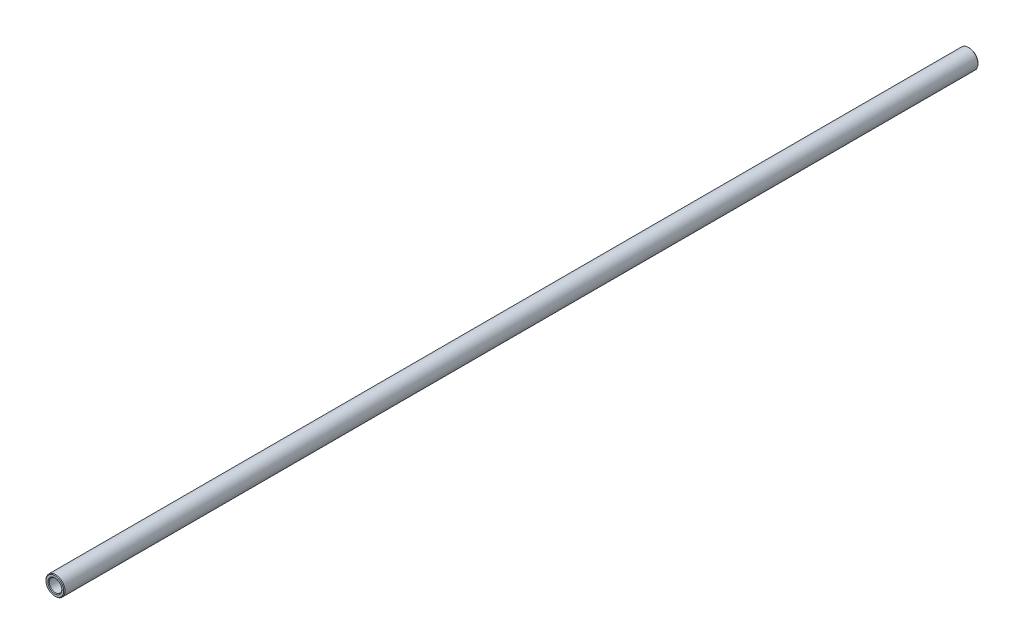
ISO-10303-21;
HEADER;
FILE_DESCRIPTION(('STEP AP214'),'2;1');
FILE_NAME('part.step','',(''),(''),'','','');
FILE_SCHEMA(('AUTOMOTIVE_DESIGN { 1 0 10303 214 1 1 1 1 }'));
ENDSEC;
DATA;
#1=APPLICATION_CONTEXT('core data for automotive mechanical design processes');
#2=APPLICATION_PROTOCOL_DEFINITION('international standard','automotive_design',2000,#1);
#3=PRODUCT_CONTEXT('',#1,'mechanical');
#4=PRODUCT('Part','Part','',(#3));
#5=PRODUCT_RELATED_PRODUCT_CATEGORY('part','',(#4));
#6=PRODUCT_DEFINITION_FORMATION('','',#4);
#7=PRODUCT_DEFINITION_CONTEXT('part definition',#1,'design');
#8=PRODUCT_DEFINITION('design','',#6,#7);
#9=PRODUCT_DEFINITION_SHAPE('','',#8);
#10=(LENGTH_UNIT() NAMED_UNIT(*) SI_UNIT(.MILLI.,.METRE.));
#11=(NAMED_UNIT(*) PLANE_ANGLE_UNIT() SI_UNIT($,.RADIAN.));
#12=(NAMED_UNIT(*) SI_UNIT($,.STERADIAN.) SOLID_ANGLE_UNIT());
#13=UNCERTAINTY_MEASURE_WITH_UNIT(LENGTH_MEASURE(1.E-05),#10,'distance_accuracy_value','');
#14=(GEOMETRIC_REPRESENTATION_CONTEXT(3) GLOBAL_UNCERTAINTY_ASSIGNED_CONTEXT((#13)) GLOBAL_UNIT_ASSIGNED_CONTEXT((#10,
#11,#12)) REPRESENTATION_CONTEXT('',''));
#15=CARTESIAN_POINT('',(0.,0.,0.));
#16=DIRECTION('',(0.,0.,1.));
#17=DIRECTION('',(1.,0.,0.));
#18=AXIS2_PLACEMENT_3D('',#15,#16,#17);
#19=CARTESIAN_POINT('',(0.,0.,-152.4));
#20=DIRECTION('',(0.,0.,1.));
#21=DIRECTION('',(1.,0.,0.));
#22=AXIS2_PLACEMENT_3D('',#19,#20,#21);
#23=CYLINDRICAL_SURFACE('',#22,3.175);
#24=CARTESIAN_POINT('',(0.,0.,152.18664));
#25=DIRECTION('',(0.,0.,1.));
#26=DIRECTION('',(1.,0.,0.));
#27=AXIS2_PLACEMENT_3D('',#24,#25,#26);
#28=CIRCLE('',#27,3.175);
#29=CARTESIAN_POINT('',(3.175,0.,152.18664));
#30=VERTEX_POINT('',#29);
#31=EDGE_CURVE('E50',#30,#30,#28,.F.);
#32=CARTESIAN_POINT('',(0.,0.,-152.18664));
#33=DIRECTION('',(0.,0.,1.));
#34=DIRECTION('',(1.,0.,0.));
#35=AXIS2_PLACEMENT_3D('',#32,#33,#34);
#36=CIRCLE('',#35,3.175);
#37=CARTESIAN_POINT('',(3.175,0.,-152.18664));
#38=VERTEX_POINT('',#37);
#39=EDGE_CURVE('E53',#38,#38,#36,.T.);
#40=CARTESIAN_POINT('',(3.175,0.,152.18664));
#41=CARTESIAN_POINT('',(3.175,0.,149.016085));
#42=CARTESIAN_POINT('',(3.175,0.,145.84553));
#43=CARTESIAN_POINT('',(3.175,0.,139.50442));
#44=CARTESIAN_POINT('',(3.175,0.,136.333865));
#45=CARTESIAN_POINT('',(3.175,0.,129.992755));
#46=CARTESIAN_POINT('',(3.175,0.,126.8222));
#47=CARTESIAN_POINT('',(3.175,0.,120.48109));
#48=CARTESIAN_POINT('',(3.175,0.,117.310535));
#49=CARTESIAN_POINT('',(3.175,0.,110.969425));
#50=CARTESIAN_POINT('',(3.175,0.,107.79887));
#51=CARTESIAN_POINT('',(3.175,0.,101.45776));
#52=CARTESIAN_POINT('',(3.175,0.,98.2872050000001));
#53=CARTESIAN_POINT('',(3.175,0.,91.9460950000001));
#54=CARTESIAN_POINT('',(3.175,0.,88.7755400000001));
#55=CARTESIAN_POINT('',(3.175,0.,82.4344300000001));
#56=CARTESIAN_POINT('',(3.175,0.,79.2638750000001));
#57=CARTESIAN_POINT('',(3.175,0.,72.9227650000001));
#58=CARTESIAN_POINT('',(3.175,0.,69.7522100000001));
#59=CARTESIAN_POINT('',(3.175,0.,63.4111000000001));
#60=CARTESIAN_POINT('',(3.175,0.,60.2405450000001));
#61=CARTESIAN_POINT('',(3.175,0.,53.8994350000001));
#62=CARTESIAN_POINT('',(3.175,0.,50.7288800000001));
#63=CARTESIAN_POINT('',(3.175,0.,44.3877700000001));
#64=CARTESIAN_POINT('',(3.175,0.,41.2172150000001));
#65=CARTESIAN_POINT('',(3.175,0.,34.8761050000001));
#66=CARTESIAN_POINT('',(3.175,0.,31.7055500000001));
#67=CARTESIAN_POINT('',(3.175,0.,25.3644400000001));
#68=CARTESIAN_POINT('',(3.175,0.,22.1938850000001));
#69=CARTESIAN_POINT('',(3.175,0.,15.8527750000001));
#70=CARTESIAN_POINT('',(3.175,0.,12.6822200000001));
#71=CARTESIAN_POINT('',(3.175,0.,6.34111000000011));
#72=CARTESIAN_POINT('',(3.175,0.,3.17055500000011));
#73=CARTESIAN_POINT('',(3.175,0.,-3.17055499999989));
#74=CARTESIAN_POINT('',(3.175,0.,-6.34110999999989));
#75=CARTESIAN_POINT('',(3.175,0.,-12.6822199999999));
#76=CARTESIAN_POINT('',(3.175,0.,-15.8527749999999));
#77=CARTESIAN_POINT('',(3.175,0.,-22.1938849999999));
#78=CARTESIAN_POINT('',(3.175,0.,-25.3644399999999));
#79=CARTESIAN_POINT('',(3.175,0.,-31.7055499999999));
#80=CARTESIAN_POINT('',(3.175,0.,-34.8761049999999));
#81=CARTESIAN_POINT('',(3.175,0.,-41.2172149999999));
#82=CARTESIAN_POINT('',(3.175,0.,-44.3877699999999));
#83=CARTESIAN_POINT('',(3.175,0.,-50.7288799999999));
#84=CARTESIAN_POINT('',(3.175,0.,-53.8994349999999));
#85=CARTESIAN_POINT('',(3.175,0.,-60.2405449999999));
#86=CARTESIAN_POINT('',(3.175,0.,-63.4110999999999));
#87=CARTESIAN_POINT('',(3.175,0.,-69.7522099999999));
#88=CARTESIAN_POINT('',(3.175,0.,-72.9227649999999));
#89=CARTESIAN_POINT('',(3.175,0.,-79.2638749999999));
#90=CARTESIAN_POINT('',(3.175,0.,-82.4344299999999));
#91=CARTESIAN_POINT('',(3.175,0.,-88.7755399999999));
#92=CARTESIAN_POINT('',(3.175,0.,-91.9460949999999));
#93=CARTESIAN_POINT('',(3.175,0.,-98.2872049999998));
#94=CARTESIAN_POINT('',(3.175,0.,-101.45776));
#95=CARTESIAN_POINT('',(3.175,0.,-107.79887));
#96=CARTESIAN_POINT('',(3.175,0.,-110.969425));
#97=CARTESIAN_POINT('',(3.175,0.,-117.310535));
#98=CARTESIAN_POINT('',(3.175,0.,-120.48109));
#99=CARTESIAN_POINT('',(3.175,0.,-126.8222));
#100=CARTESIAN_POINT('',(3.175,0.,-129.992755));
#101=CARTESIAN_POINT('',(3.175,0.,-136.333865));
#102=CARTESIAN_POINT('',(3.175,0.,-139.50442));
#103=CARTESIAN_POINT('',(3.175,0.,-145.84553));
#104=CARTESIAN_POINT('',(3.175,0.,-149.016085));
#105=CARTESIAN_POINT('',(3.175,0.,-152.18664));
#106=B_SPLINE_CURVE_WITH_KNOTS('',3,(#40,#41,#42,#43,#44,#45,#46,#47,#48,#49,#50,#51,#52,#53,
#54,#55,#56,#57,#58,#59,#60,#61,#62,#63,#64,#65,#66,#67,#68,#69,#70,#71,#72,#73,#74,#75,#76,#77,
#78,#79,#80,#81,#82,#83,#84,#85,#86,#87,#88,#89,#90,#91,#92,#93,#94,#95,#96,#97,#98,#99,#100,
#101,#102,#103,#104,#105),.UNSPECIFIED.,.F.,.F.,(4,2,2,2,2,2,2,2,2,2,2,2,2,2,2,2,2,2,2,2,2,2,2,
2,2,2,2,2,2,2,2,2,4),(0.,9.511665,19.02333,28.534995,38.04666,47.558325,57.06999,66.581655,
76.09332,85.604985,95.11665,104.628315,114.13998,123.651645,133.16331,142.674975,152.18664,
161.698305,171.20997,180.721635,190.2333,199.744965,209.25663,218.768295,228.27996,237.791625,
247.30329,256.814955,266.32662,275.838285,285.34995,294.861615,304.37328),.UNSPECIFIED.);
#107=EDGE_CURVE('BSEAM30',#30,#38,#106,.T.);
#108=ORIENTED_EDGE('',*,*,#31,.T.);
#109=ORIENTED_EDGE('',*,*,#39,.T.);
#110=ORIENTED_EDGE('',*,*,#107,.T.);
#111=ORIENTED_EDGE('',*,*,#107,.F.);
#112=EDGE_LOOP('',(#108,#110,#109,#111));
#113=FACE_BOUND('',#112,.T.);
#114=ADVANCED_FACE('F30',(#113),#23,.T.);
#115=CARTESIAN_POINT('',(0.,0.,-152.4));
#116=DIRECTION('',(0.,0.,1.));
#117=DIRECTION('',(1.,0.,0.));
#118=AXIS2_PLACEMENT_3D('',#115,#116,#117);
#119=PLANE('',#118);
#120=CARTESIAN_POINT('',(0.,0.,-152.4));
#121=DIRECTION('',(0.,0.,1.));
#122=DIRECTION('',(1.,0.,0.));
#123=AXIS2_PLACEMENT_3D('',#120,#121,#122);
#124=CIRCLE('',#123,2.96163999999979);
#125=CARTESIAN_POINT('',(2.96163999999979,0.,-152.4));
#126=VERTEX_POINT('',#125);
#127=EDGE_CURVE('E41',#126,#126,#124,.F.);
#128=ORIENTED_EDGE('',*,*,#127,.T.);
#129=EDGE_LOOP('',(#128));
#130=FACE_BOUND('',#129,.T.);
#131=CARTESIAN_POINT('',(0.,0.,-152.4));
#132=DIRECTION('',(0.,0.,1.));
#133=DIRECTION('',(1.,0.,0.));
#134=AXIS2_PLACEMENT_3D('',#131,#132,#133);
#135=CIRCLE('',#134,2.32155999999975);
#136=CARTESIAN_POINT('',(2.32155999999975,0.,-152.4));
#137=VERTEX_POINT('',#136);
#138=EDGE_CURVE('E45',#137,#137,#135,.T.);
#139=ORIENTED_EDGE('',*,*,#138,.T.);
#140=EDGE_LOOP('',(#139));
#141=FACE_BOUND('',#140,.T.);
#142=ADVANCED_FACE('F78',(#130,#141),#119,.F.);
#143=CARTESIAN_POINT('',(0.,0.,-152.4));
#144=DIRECTION('',(0.,0.,1.));
#145=DIRECTION('',(1.,0.,0.));
#146=AXIS2_PLACEMENT_3D('',#143,#144,#145);
#147=CYLINDRICAL_SURFACE('',#146,2.1082);
#148=CARTESIAN_POINT('',(0.,0.,152.18664));
#149=DIRECTION('',(0.,0.,1.));
#150=DIRECTION('',(1.,0.,0.));
#151=AXIS2_PLACEMENT_3D('',#148,#149,#150);
#152=CIRCLE('',#151,2.1082);
#153=CARTESIAN_POINT('',(2.1082,0.,152.18664));
#154=VERTEX_POINT('',#153);
#155=EDGE_CURVE('E10',#154,#154,#152,.T.);
#156=CARTESIAN_POINT('',(0.,0.,-152.18664));
#157=DIRECTION('',(0.,0.,1.));
#158=DIRECTION('',(1.,0.,0.));
#159=AXIS2_PLACEMENT_3D('',#156,#157,#158);
#160=CIRCLE('',#159,2.1082);
#161=CARTESIAN_POINT('',(2.1082,0.,-152.18664));
#162=VERTEX_POINT('',#161);
#163=EDGE_CURVE('E37',#162,#162,#160,.F.);
#164=CARTESIAN_POINT('',(2.1082,0.,152.18664));
#165=CARTESIAN_POINT('',(2.1082,0.,149.016085));
#166=CARTESIAN_POINT('',(2.1082,0.,145.84553));
#167=CARTESIAN_POINT('',(2.1082,0.,139.50442));
#168=CARTESIAN_POINT('',(2.1082,0.,136.333865));
#169=CARTESIAN_POINT('',(2.1082,0.,129.992755));
#170=CARTESIAN_POINT('',(2.1082,0.,126.8222));
#171=CARTESIAN_POINT('',(2.1082,0.,120.48109));
#172=CARTESIAN_POINT('',(2.1082,0.,117.310535));
#173=CARTESIAN_POINT('',(2.1082,0.,110.969425));
#174=CARTESIAN_POINT('',(2.1082,0.,107.79887));
#175=CARTESIAN_POINT('',(2.1082,0.,101.45776));
#176=CARTESIAN_POINT('',(2.1082,0.,98.2872049999997));
#177=CARTESIAN_POINT('',(2.1082,0.,91.9460949999997));
#178=CARTESIAN_POINT('',(2.1082,0.,88.7755399999998));
#179=CARTESIAN_POINT('',(2.1082,0.,82.4344299999997));
#180=CARTESIAN_POINT('',(2.1082,0.,79.2638749999997));
#181=CARTESIAN_POINT('',(2.1082,0.,72.9227649999997));
#182=CARTESIAN_POINT('',(2.1082,0.,69.7522099999997));
#183=CARTESIAN_POINT('',(2.1082,0.,63.4110999999997));
#184=CARTESIAN_POINT('',(2.1082,0.,60.2405449999997));
#185=CARTESIAN_POINT('',(2.1082,0.,53.8994349999997));
#186=CARTESIAN_POINT('',(2.1082,0.,50.7288799999997));
#187=CARTESIAN_POINT('',(2.1082,0.,44.3877699999997));
#188=CARTESIAN_POINT('',(2.1082,0.,41.2172149999998));
#189=CARTESIAN_POINT('',(2.1082,0.,34.8761049999998));
#190=CARTESIAN_POINT('',(2.1082,0.,31.7055499999998));
#191=CARTESIAN_POINT('',(2.1082,0.,25.3644399999998));
#192=CARTESIAN_POINT('',(2.1082,0.,22.1938849999998));
#193=CARTESIAN_POINT('',(2.1082,0.,15.8527749999998));
#194=CARTESIAN_POINT('',(2.1082,0.,12.6822199999998));
#195=CARTESIAN_POINT('',(2.1082,0.,6.34110999999975));
#196=CARTESIAN_POINT('',(2.1082,0.,3.17055499999975));
#197=CARTESIAN_POINT('',(2.1082,0.,-3.17055500000025));
#198=CARTESIAN_POINT('',(2.1082,0.,-6.34111000000025));
#199=CARTESIAN_POINT('',(2.1082,0.,-12.6822200000003));
#200=CARTESIAN_POINT('',(2.1082,0.,-15.8527750000003));
#201=CARTESIAN_POINT('',(2.1082,0.,-22.1938850000003));
#202=CARTESIAN_POINT('',(2.1082,0.,-25.3644400000002));
#203=CARTESIAN_POINT('',(2.1082,0.,-31.7055500000002));
#204=CARTESIAN_POINT('',(2.1082,0.,-34.8761050000002));
#205=CARTESIAN_POINT('',(2.1082,0.,-41.2172150000002));
#206=CARTESIAN_POINT('',(2.1082,0.,-44.3877700000003));
#207=CARTESIAN_POINT('',(2.1082,0.,-50.7288800000002));
#208=CARTESIAN_POINT('',(2.1082,0.,-53.8994350000003));
#209=CARTESIAN_POINT('',(2.1082,0.,-60.2405450000002));
#210=CARTESIAN_POINT('',(2.1082,0.,-63.4111000000002));
#211=CARTESIAN_POINT('',(2.1082,0.,-69.7522100000002));
#212=CARTESIAN_POINT('',(2.1082,0.,-72.9227650000002));
#213=CARTESIAN_POINT('',(2.1082,0.,-79.2638750000002));
#214=CARTESIAN_POINT('',(2.1082,0.,-82.4344300000002));
#215=CARTESIAN_POINT('',(2.1082,0.,-88.7755400000002));
#216=CARTESIAN_POINT('',(2.1082,0.,-91.9460950000002));
#217=CARTESIAN_POINT('',(2.1082,0.,-98.2872050000002));
#218=CARTESIAN_POINT('',(2.1082,0.,-101.45776));
#219=CARTESIAN_POINT('',(2.1082,0.,-107.79887));
#220=CARTESIAN_POINT('',(2.1082,0.,-110.969425));
#221=CARTESIAN_POINT('',(2.1082,0.,-117.310535));
#222=CARTESIAN_POINT('',(2.1082,0.,-120.48109));
#223=CARTESIAN_POINT('',(2.1082,0.,-126.8222));
#224=CARTESIAN_POINT('',(2.1082,0.,-129.992755));
#225=CARTESIAN_POINT('',(2.1082,0.,-136.333865));
#226=CARTESIAN_POINT('',(2.1082,0.,-139.50442));
#227=CARTESIAN_POINT('',(2.1082,0.,-145.84553));
#228=CARTESIAN_POINT('',(2.1082,0.,-149.016085));
#229=CARTESIAN_POINT('',(2.1082,0.,-152.18664));
#230=B_SPLINE_CURVE_WITH_KNOTS('',3,(#164,#165,#166,#167,#168,#169,#170,#171,#172,#173,#174,
#175,#176,#177,#178,#179,#180,#181,#182,#183,#184,#185,#186,#187,#188,#189,#190,#191,#192,#193,
#194,#195,#196,#197,#198,#199,#200,#201,#202,#203,#204,#205,#206,#207,#208,#209,#210,#211,#212,
#213,#214,#215,#216,#217,#218,#219,#220,#221,#222,#223,#224,#225,#226,#227,#228,#229),
.UNSPECIFIED.,.F.,.F.,(4,2,2,2,2,2,2,2,2,2,2,2,2,2,2,2,2,2,2,2,2,2,2,2,2,2,2,2,2,2,2,2,4),(0.,
9.511665,19.02333,28.534995,38.04666,47.558325,57.06999,66.581655,76.09332,85.604985,95.11665,
104.628315,114.13998,123.651645,133.16331,142.674975,152.18664,161.698305,171.20997,180.721635,
190.2333,199.744965,209.25663,218.768295,228.27996,237.791625,247.30329,256.814955,266.32662,
275.838285,285.34995,294.861615,304.37328),.UNSPECIFIED.);
#231=EDGE_CURVE('BSEAM84',#154,#162,#230,.T.);
#232=ORIENTED_EDGE('',*,*,#155,.T.);
#233=ORIENTED_EDGE('',*,*,#163,.T.);
#234=ORIENTED_EDGE('',*,*,#231,.T.);
#235=ORIENTED_EDGE('',*,*,#231,.F.);
#236=EDGE_LOOP('',(#232,#234,#233,#235));
#237=FACE_BOUND('',#236,.T.);
#238=ADVANCED_FACE('F84',(#237),#147,.F.);
#239=CARTESIAN_POINT('',(0.,0.,152.4));
#240=DIRECTION('',(0.,0.,1.));
#241=DIRECTION('',(1.,0.,0.));
#242=AXIS2_PLACEMENT_3D('',#239,#240,#241);
#243=PLANE('',#242);
#244=CARTESIAN_POINT('',(0.,0.,152.4));
#245=DIRECTION('',(0.,0.,1.));
#246=DIRECTION('',(1.,0.,0.));
#247=AXIS2_PLACEMENT_3D('',#244,#245,#246);
#248=CIRCLE('',#247,2.96164000000004);
#249=CARTESIAN_POINT('',(2.96164000000004,0.,152.4));
#250=VERTEX_POINT('',#249);
#251=EDGE_CURVE('E56',#250,#250,#248,.T.);
#252=ORIENTED_EDGE('',*,*,#251,.T.);
#253=EDGE_LOOP('',(#252));
#254=FACE_BOUND('',#253,.T.);
#255=CARTESIAN_POINT('',(0.,0.,152.4));
#256=DIRECTION('',(0.,0.,1.));
#257=DIRECTION('',(1.,0.,0.));
#258=AXIS2_PLACEMENT_3D('',#255,#256,#257);
#259=CIRCLE('',#258,2.32156000000028);
#260=CARTESIAN_POINT('',(2.32156000000028,0.,152.4));
#261=VERTEX_POINT('',#260);
#262=EDGE_CURVE('E59',#261,#261,#259,.F.);
#263=ORIENTED_EDGE('',*,*,#262,.T.);
#264=EDGE_LOOP('',(#263));
#265=FACE_BOUND('',#264,.T.);
#266=ADVANCED_FACE('F63',(#254,#265),#243,.T.);
#267=CARTESIAN_POINT('',(0.,0.,152.4));
#268=DIRECTION('',(0.,0.,-1.));
#269=DIRECTION('',(-1.,0.,0.));
#270=AXIS2_PLACEMENT_3D('',#267,#268,#269);
#271=CONICAL_SURFACE('',#270,2.96164000000004,0.785398163397619);
#272=ORIENTED_EDGE('',*,*,#31,.F.);
#273=EDGE_LOOP('',(#272));
#274=FACE_BOUND('',#273,.T.);
#275=ORIENTED_EDGE('',*,*,#251,.F.);
#276=EDGE_LOOP('',(#275));
#277=FACE_BOUND('',#276,.T.);
#278=ADVANCED_FACE('F74',(#274,#277),#271,.T.);
#279=CARTESIAN_POINT('',(0.,0.,-152.18664));
#280=DIRECTION('',(0.,0.,1.));
#281=DIRECTION('',(1.,0.,0.));
#282=AXIS2_PLACEMENT_3D('',#279,#280,#281);
#283=CONICAL_SURFACE('',#282,3.175,0.785398163397488);
#284=ORIENTED_EDGE('',*,*,#127,.F.);
#285=EDGE_LOOP('',(#284));
#286=FACE_BOUND('',#285,.T.);
#287=ORIENTED_EDGE('',*,*,#39,.F.);
#288=EDGE_LOOP('',(#287));
#289=FACE_BOUND('',#288,.T.);
#290=ADVANCED_FACE('F68',(#286,#289),#283,.T.);
#291=CARTESIAN_POINT('',(0.,0.,152.18664));
#292=DIRECTION('',(0.,0.,1.));
#293=DIRECTION('',(1.,0.,0.));
#294=AXIS2_PLACEMENT_3D('',#291,#292,#293);
#295=CONICAL_SURFACE('',#294,2.1082,0.785398163397457);
#296=ORIENTED_EDGE('',*,*,#262,.F.);
#297=EDGE_LOOP('',(#296));
#298=FACE_BOUND('',#297,.T.);
#299=ORIENTED_EDGE('',*,*,#155,.F.);
#300=EDGE_LOOP('',(#299));
#301=FACE_BOUND('',#300,.T.);
#302=ADVANCED_FACE('F65',(#298,#301),#295,.F.);
#303=CARTESIAN_POINT('',(0.,0.,-152.4));
#304=DIRECTION('',(0.,0.,-1.));
#305=DIRECTION('',(-1.,0.,0.));
#306=AXIS2_PLACEMENT_3D('',#303,#304,#305);
#307=CONICAL_SURFACE('',#306,2.32155999999975,0.785398163397392);
#308=ORIENTED_EDGE('',*,*,#163,.F.);
#309=EDGE_LOOP('',(#308));
#310=FACE_BOUND('',#309,.T.);
#311=ORIENTED_EDGE('',*,*,#138,.F.);
#312=EDGE_LOOP('',(#311));
#313=FACE_BOUND('',#312,.T.);
#314=ADVANCED_FACE('F32',(#310,#313),#307,.F.);
#315=CLOSED_SHELL('',(#114,#142,#238,#266,#278,#290,#302,#314));
#316=MANIFOLD_SOLID_BREP('B2',#315);
#317=ADVANCED_BREP_SHAPE_REPRESENTATION('',(#18,#316),#14);
#318=SHAPE_DEFINITION_REPRESENTATION(#9,#317);
ENDSEC;
END-ISO-10303-21;
